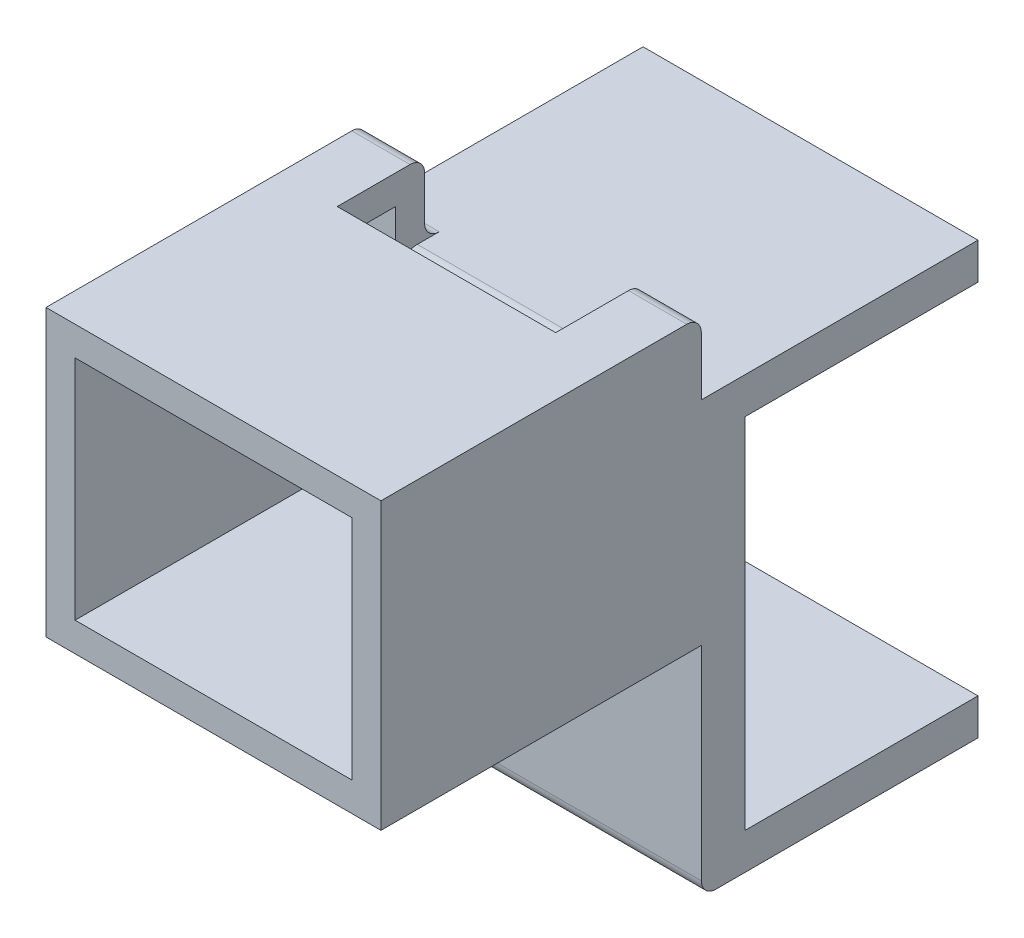
ISO-10303-21;
HEADER;
FILE_DESCRIPTION(('STEP AP214'),'2;1');
FILE_NAME('part.step','',(''),(''),'','','');
FILE_SCHEMA(('AUTOMOTIVE_DESIGN { 1 0 10303 214 1 1 1 1 }'));
ENDSEC;
DATA;
#1=APPLICATION_CONTEXT('core data for automotive mechanical design processes');
#2=APPLICATION_PROTOCOL_DEFINITION('international standard','automotive_design',2000,#1);
#3=PRODUCT_CONTEXT('',#1,'mechanical');
#4=PRODUCT('Part','Part','',(#3));
#5=PRODUCT_RELATED_PRODUCT_CATEGORY('part','',(#4));
#6=PRODUCT_DEFINITION_FORMATION('','',#4);
#7=PRODUCT_DEFINITION_CONTEXT('part definition',#1,'design');
#8=PRODUCT_DEFINITION('design','',#6,#7);
#9=PRODUCT_DEFINITION_SHAPE('','',#8);
#10=(LENGTH_UNIT() NAMED_UNIT(*) SI_UNIT(.MILLI.,.METRE.));
#11=(NAMED_UNIT(*) PLANE_ANGLE_UNIT() SI_UNIT($,.RADIAN.));
#12=(NAMED_UNIT(*) SI_UNIT($,.STERADIAN.) SOLID_ANGLE_UNIT());
#13=UNCERTAINTY_MEASURE_WITH_UNIT(LENGTH_MEASURE(1.E-05),#10,'distance_accuracy_value','');
#14=(GEOMETRIC_REPRESENTATION_CONTEXT(3) GLOBAL_UNCERTAINTY_ASSIGNED_CONTEXT((#13)) GLOBAL_UNIT_ASSIGNED_CONTEXT((#10,
#11,#12)) REPRESENTATION_CONTEXT('',''));
#15=CARTESIAN_POINT('',(0.,0.,0.));
#16=DIRECTION('',(0.,0.,1.));
#17=DIRECTION('',(1.,0.,0.));
#18=AXIS2_PLACEMENT_3D('',#15,#16,#17);
#19=CARTESIAN_POINT('',(0.,0.,-1.5));
#20=DIRECTION('',(0.,0.,1.));
#21=DIRECTION('',(1.,0.,0.));
#22=AXIS2_PLACEMENT_3D('',#19,#20,#21);
#23=PLANE('',#22);
#24=DIRECTION('',(1.,0.,0.));
#25=VECTOR('',#24,1.);
#26=CARTESIAN_POINT('',(11.5,-6.25,-1.5));
#27=LINE('',#26,#25);
#28=CARTESIAN_POINT('',(0.,-6.25,-1.5));
#29=VERTEX_POINT('',#28);
#30=CARTESIAN_POINT('',(11.5,-6.25,-1.5));
#31=VERTEX_POINT('',#30);
#32=EDGE_CURVE('E245',#29,#31,#27,.T.);
#33=ORIENTED_EDGE('',*,*,#32,.F.);
#34=DIRECTION('',(0.,1.,0.));
#35=VECTOR('',#34,1.);
#36=CARTESIAN_POINT('',(0.,-7.5,-1.5));
#37=LINE('',#36,#35);
#38=CARTESIAN_POINT('',(0.,6.05,-1.5));
#39=VERTEX_POINT('',#38);
#40=EDGE_CURVE('E280',#29,#39,#37,.T.);
#41=ORIENTED_EDGE('',*,*,#40,.T.);
#42=DIRECTION('',(-1.,0.,0.));
#43=VECTOR('',#42,1.);
#44=CARTESIAN_POINT('',(11.5,6.05,-1.5));
#45=LINE('',#44,#43);
#46=CARTESIAN_POINT('',(11.5,6.05,-1.5));
#47=VERTEX_POINT('',#46);
#48=EDGE_CURVE('E257',#47,#39,#45,.T.);
#49=ORIENTED_EDGE('',*,*,#48,.F.);
#50=DIRECTION('',(0.,-1.,0.));
#51=VECTOR('',#50,1.);
#52=CARTESIAN_POINT('',(11.5,-7.5,-1.5));
#53=LINE('',#52,#51);
#54=EDGE_CURVE('E278',#47,#31,#53,.T.);
#55=ORIENTED_EDGE('',*,*,#54,.T.);
#56=EDGE_LOOP('',(#33,#41,#49,#55));
#57=FACE_BOUND('',#56,.T.);
#58=ADVANCED_FACE('F33',(#57),#23,.F.);
#59=CARTESIAN_POINT('',(0.,0.,0.));
#60=DIRECTION('',(0.,0.,-1.));
#61=DIRECTION('',(-1.,0.,0.));
#62=AXIS2_PLACEMENT_3D('',#59,#60,#61);
#63=PLANE('',#62);
#64=DIRECTION('',(0.,-1.,0.));
#65=VECTOR('',#64,1.);
#66=CARTESIAN_POINT('',(0.,0.,0.));
#67=LINE('',#66,#65);
#68=CARTESIAN_POINT('',(0.,9.3,0.));
#69=VERTEX_POINT('',#68);
#70=CARTESIAN_POINT('',(0.,7.8,0.));
#71=VERTEX_POINT('',#70);
#72=EDGE_CURVE('E350',#69,#71,#67,.T.);
#73=ORIENTED_EDGE('',*,*,#72,.F.);
#74=DIRECTION('',(-1.,0.,0.));
#75=VECTOR('',#74,1.);
#76=CARTESIAN_POINT('',(2.,9.3,0.));
#77=LINE('',#76,#75);
#78=CARTESIAN_POINT('',(2.,9.3,0.));
#79=VERTEX_POINT('',#78);
#80=EDGE_CURVE('E425',#69,#79,#77,.F.);
#81=ORIENTED_EDGE('',*,*,#80,.T.);
#82=DIRECTION('',(0.,1.,0.));
#83=VECTOR('',#82,1.);
#84=CARTESIAN_POINT('',(2.,7.3,0.));
#85=LINE('',#84,#83);
#86=CARTESIAN_POINT('',(2.,7.8,0.));
#87=VERTEX_POINT('',#86);
#88=EDGE_CURVE('E309',#87,#79,#85,.T.);
#89=ORIENTED_EDGE('',*,*,#88,.F.);
#90=DIRECTION('',(1.,0.,0.));
#91=VECTOR('',#90,1.);
#92=CARTESIAN_POINT('',(0.,7.8,0.));
#93=LINE('',#92,#91);
#94=EDGE_CURVE('E423',#87,#71,#93,.F.);
#95=ORIENTED_EDGE('',*,*,#94,.T.);
#96=EDGE_LOOP('',(#73,#81,#89,#95));
#97=FACE_BOUND('',#96,.T.);
#98=ADVANCED_FACE('F444',(#97),#63,.T.);
#99=CARTESIAN_POINT('',(0.,0.,11.));
#100=DIRECTION('',(1.,0.,0.));
#101=DIRECTION('',(0.,0.,-1.));
#102=AXIS2_PLACEMENT_3D('',#99,#100,#101);
#103=PLANE('',#102);
#104=DIRECTION('',(0.,0.,-1.));
#105=VECTOR('',#104,1.);
#106=CARTESIAN_POINT('',(0.,9.8,11.));
#107=LINE('',#106,#105);
#108=CARTESIAN_POINT('',(0.,9.8,11.));
#109=VERTEX_POINT('',#108);
#110=CARTESIAN_POINT('',(0.,9.8,0.5));
#111=VERTEX_POINT('',#110);
#112=EDGE_CURVE('E367',#109,#111,#107,.T.);
#113=ORIENTED_EDGE('',*,*,#112,.T.);
#114=CARTESIAN_POINT('',(0.,9.3,0.5));
#115=DIRECTION('',(1.,0.,0.));
#116=DIRECTION('',(0.,0.,-1.));
#117=AXIS2_PLACEMENT_3D('',#114,#115,#116);
#118=CIRCLE('',#117,0.5);
#119=EDGE_CURVE('E421',#111,#69,#118,.F.);
#120=ORIENTED_EDGE('',*,*,#119,.T.);
#121=ORIENTED_EDGE('',*,*,#72,.T.);
#122=CARTESIAN_POINT('',(0.,7.8,-0.5));
#123=DIRECTION('',(1.,0.,0.));
#124=DIRECTION('',(0.,0.,-1.));
#125=AXIS2_PLACEMENT_3D('',#122,#123,#124);
#126=CIRCLE('',#125,0.5);
#127=CARTESIAN_POINT('',(0.,7.3,-0.5));
#128=VERTEX_POINT('',#127);
#129=EDGE_CURVE('E11',#71,#128,#126,.T.);
#130=ORIENTED_EDGE('',*,*,#129,.T.);
#131=DIRECTION('',(0.,0.,1.));
#132=VECTOR('',#131,1.);
#133=CARTESIAN_POINT('',(0.,7.3,-1.5));
#134=LINE('',#133,#132);
#135=CARTESIAN_POINT('',(0.,7.3,-9.5));
#136=VERTEX_POINT('',#135);
#137=EDGE_CURVE('E293',#136,#128,#134,.T.);
#138=ORIENTED_EDGE('',*,*,#137,.F.);
#139=DIRECTION('',(0.,1.,0.));
#140=VECTOR('',#139,1.);
#141=CARTESIAN_POINT('',(0.,6.05,-9.5));
#142=LINE('',#141,#140);
#143=CARTESIAN_POINT('',(0.,6.05,-9.5));
#144=VERTEX_POINT('',#143);
#145=EDGE_CURVE('E263',#144,#136,#142,.T.);
#146=ORIENTED_EDGE('',*,*,#145,.F.);
#147=DIRECTION('',(0.,0.,1.));
#148=VECTOR('',#147,1.);
#149=CARTESIAN_POINT('',(0.,6.05,-9.5));
#150=LINE('',#149,#148);
#151=EDGE_CURVE('E269',#144,#39,#150,.T.);
#152=ORIENTED_EDGE('',*,*,#151,.T.);
#153=ORIENTED_EDGE('',*,*,#40,.F.);
#154=DIRECTION('',(0.,0.,1.));
#155=VECTOR('',#154,1.);
#156=CARTESIAN_POINT('',(0.,-6.25,-9.5));
#157=LINE('',#156,#155);
#158=CARTESIAN_POINT('',(0.,-6.25,-9.5));
#159=VERTEX_POINT('',#158);
#160=EDGE_CURVE('E254',#159,#29,#157,.T.);
#161=ORIENTED_EDGE('',*,*,#160,.F.);
#162=DIRECTION('',(0.,1.,0.));
#163=VECTOR('',#162,1.);
#164=CARTESIAN_POINT('',(0.,-7.5,-9.5));
#165=LINE('',#164,#163);
#166=CARTESIAN_POINT('',(0.,-7.5,-9.5));
#167=VERTEX_POINT('',#166);
#168=EDGE_CURVE('E239',#167,#159,#165,.T.);
#169=ORIENTED_EDGE('',*,*,#168,.F.);
#170=DIRECTION('',(0.,0.,1.));
#171=VECTOR('',#170,1.);
#172=CARTESIAN_POINT('',(0.,-7.5,-1.5));
#173=LINE('',#172,#171);
#174=CARTESIAN_POINT('',(0.,-7.5,-0.5));
#175=VERTEX_POINT('',#174);
#176=EDGE_CURVE('E231',#167,#175,#173,.T.);
#177=ORIENTED_EDGE('',*,*,#176,.T.);
#178=CARTESIAN_POINT('',(0.,-7.,-0.5));
#179=DIRECTION('',(1.,0.,0.));
#180=DIRECTION('',(0.,0.,-1.));
#181=AXIS2_PLACEMENT_3D('',#178,#179,#180);
#182=CIRCLE('',#181,0.5);
#183=CARTESIAN_POINT('',(0.,-7.,0.));
#184=VERTEX_POINT('',#183);
#185=EDGE_CURVE('E410',#175,#184,#182,.F.);
#186=ORIENTED_EDGE('',*,*,#185,.T.);
#187=DIRECTION('',(0.,1.,0.));
#188=VECTOR('',#187,1.);
#189=CARTESIAN_POINT('',(0.,-7.5,0.));
#190=LINE('',#189,#188);
#191=CARTESIAN_POINT('',(0.,0.,0.));
#192=VERTEX_POINT('',#191);
#193=EDGE_CURVE('E281',#184,#192,#190,.T.);
#194=ORIENTED_EDGE('',*,*,#193,.T.);
#195=DIRECTION('',(0.,0.,-1.));
#196=VECTOR('',#195,1.);
#197=CARTESIAN_POINT('',(0.,0.,11.));
#198=LINE('',#197,#196);
#199=CARTESIAN_POINT('',(0.,0.,11.));
#200=VERTEX_POINT('',#199);
#201=EDGE_CURVE('E381',#200,#192,#198,.T.);
#202=ORIENTED_EDGE('',*,*,#201,.F.);
#203=DIRECTION('',(0.,-1.,0.));
#204=VECTOR('',#203,1.);
#205=CARTESIAN_POINT('',(0.,0.,11.));
#206=LINE('',#205,#204);
#207=EDGE_CURVE('E357',#109,#200,#206,.T.);
#208=ORIENTED_EDGE('',*,*,#207,.F.);
#209=EDGE_LOOP('',(#113,#120,#121,#130,#138,#146,#152,#153,#161,#169,#177,#186,#194,#202,#208));
#210=FACE_BOUND('',#209,.T.);
#211=ADVANCED_FACE('F448',(#210),#103,.F.);
#212=CARTESIAN_POINT('',(0.,0.,11.));
#213=DIRECTION('',(0.,1.,0.));
#214=DIRECTION('',(0.,0.,1.));
#215=AXIS2_PLACEMENT_3D('',#212,#213,#214);
#216=PLANE('',#215);
#217=DIRECTION('',(1.,0.,0.));
#218=VECTOR('',#217,1.);
#219=CARTESIAN_POINT('',(0.,0.,0.));
#220=LINE('',#219,#218);
#221=CARTESIAN_POINT('',(11.5,0.,0.));
#222=VERTEX_POINT('',#221);
#223=EDGE_CURVE('E370',#192,#222,#220,.T.);
#224=ORIENTED_EDGE('',*,*,#223,.T.);
#225=DIRECTION('',(0.,0.,-1.));
#226=VECTOR('',#225,1.);
#227=CARTESIAN_POINT('',(11.5,0.,11.));
#228=LINE('',#227,#226);
#229=CARTESIAN_POINT('',(11.5,0.,11.));
#230=VERTEX_POINT('',#229);
#231=EDGE_CURVE('E378',#230,#222,#228,.T.);
#232=ORIENTED_EDGE('',*,*,#231,.F.);
#233=DIRECTION('',(1.,0.,0.));
#234=VECTOR('',#233,1.);
#235=CARTESIAN_POINT('',(0.,0.,11.));
#236=LINE('',#235,#234);
#237=EDGE_CURVE('E360',#200,#230,#236,.T.);
#238=ORIENTED_EDGE('',*,*,#237,.F.);
#239=ORIENTED_EDGE('',*,*,#201,.T.);
#240=EDGE_LOOP('',(#224,#232,#238,#239));
#241=FACE_BOUND('',#240,.T.);
#242=ADVANCED_FACE('F527',(#241),#216,.F.);
#243=CARTESIAN_POINT('',(11.5,0.,11.));
#244=DIRECTION('',(-1.,0.,0.));
#245=DIRECTION('',(0.,0.,1.));
#246=AXIS2_PLACEMENT_3D('',#243,#244,#245);
#247=PLANE('',#246);
#248=DIRECTION('',(0.,1.,0.));
#249=VECTOR('',#248,1.);
#250=CARTESIAN_POINT('',(11.5,0.,0.));
#251=LINE('',#250,#249);
#252=CARTESIAN_POINT('',(11.5,7.3,0.));
#253=VERTEX_POINT('',#252);
#254=CARTESIAN_POINT('',(11.5,9.3,0.));
#255=VERTEX_POINT('',#254);
#256=EDGE_CURVE('E361',#253,#255,#251,.T.);
#257=ORIENTED_EDGE('',*,*,#256,.T.);
#258=CARTESIAN_POINT('',(11.5,9.3,0.5));
#259=DIRECTION('',(-1.,0.,0.));
#260=DIRECTION('',(0.,0.,1.));
#261=AXIS2_PLACEMENT_3D('',#258,#259,#260);
#262=CIRCLE('',#261,0.5);
#263=CARTESIAN_POINT('',(11.5,9.8,0.5));
#264=VERTEX_POINT('',#263);
#265=EDGE_CURVE('E432',#255,#264,#262,.F.);
#266=ORIENTED_EDGE('',*,*,#265,.T.);
#267=DIRECTION('',(0.,0.,-1.));
#268=VECTOR('',#267,1.);
#269=CARTESIAN_POINT('',(11.5,9.8,11.));
#270=LINE('',#269,#268);
#271=CARTESIAN_POINT('',(11.5,9.8,11.));
#272=VERTEX_POINT('',#271);
#273=EDGE_CURVE('E375',#272,#264,#270,.T.);
#274=ORIENTED_EDGE('',*,*,#273,.F.);
#275=DIRECTION('',(0.,1.,0.));
#276=VECTOR('',#275,1.);
#277=CARTESIAN_POINT('',(11.5,0.,11.));
#278=LINE('',#277,#276);
#279=EDGE_CURVE('E363',#230,#272,#278,.T.);
#280=ORIENTED_EDGE('',*,*,#279,.F.);
#281=ORIENTED_EDGE('',*,*,#231,.T.);
#282=DIRECTION('',(0.,-1.,0.));
#283=VECTOR('',#282,1.);
#284=CARTESIAN_POINT('',(11.5,-7.5,0.));
#285=LINE('',#284,#283);
#286=CARTESIAN_POINT('',(11.5,-7.,0.));
#287=VERTEX_POINT('',#286);
#288=EDGE_CURVE('E277',#222,#287,#285,.T.);
#289=ORIENTED_EDGE('',*,*,#288,.T.);
#290=CARTESIAN_POINT('',(11.5,-7.,-0.5));
#291=DIRECTION('',(-1.,0.,0.));
#292=DIRECTION('',(0.,0.,1.));
#293=AXIS2_PLACEMENT_3D('',#290,#291,#292);
#294=CIRCLE('',#293,0.5);
#295=CARTESIAN_POINT('',(11.5,-7.5,-0.5));
#296=VERTEX_POINT('',#295);
#297=EDGE_CURVE('E226',#287,#296,#294,.F.);
#298=ORIENTED_EDGE('',*,*,#297,.T.);
#299=DIRECTION('',(0.,0.,1.));
#300=VECTOR('',#299,1.);
#301=CARTESIAN_POINT('',(11.5,-7.5,-1.5));
#302=LINE('',#301,#300);
#303=CARTESIAN_POINT('',(11.5,-7.5,-9.5));
#304=VERTEX_POINT('',#303);
#305=EDGE_CURVE('E218',#304,#296,#302,.T.);
#306=ORIENTED_EDGE('',*,*,#305,.F.);
#307=DIRECTION('',(0.,-1.,0.));
#308=VECTOR('',#307,1.);
#309=CARTESIAN_POINT('',(11.5,-7.5,-9.5));
#310=LINE('',#309,#308);
#311=CARTESIAN_POINT('',(11.5,-6.25,-9.5));
#312=VERTEX_POINT('',#311);
#313=EDGE_CURVE('E223',#312,#304,#310,.T.);
#314=ORIENTED_EDGE('',*,*,#313,.F.);
#315=DIRECTION('',(0.,0.,1.));
#316=VECTOR('',#315,1.);
#317=CARTESIAN_POINT('',(11.5,-6.25,-9.5));
#318=LINE('',#317,#316);
#319=EDGE_CURVE('E251',#312,#31,#318,.T.);
#320=ORIENTED_EDGE('',*,*,#319,.T.);
#321=ORIENTED_EDGE('',*,*,#54,.F.);
#322=DIRECTION('',(0.,0.,1.));
#323=VECTOR('',#322,1.);
#324=CARTESIAN_POINT('',(11.5,6.05,-9.5));
#325=LINE('',#324,#323);
#326=CARTESIAN_POINT('',(11.5,6.05,-9.5));
#327=VERTEX_POINT('',#326);
#328=EDGE_CURVE('E274',#327,#47,#325,.T.);
#329=ORIENTED_EDGE('',*,*,#328,.F.);
#330=DIRECTION('',(0.,-1.,0.));
#331=VECTOR('',#330,1.);
#332=CARTESIAN_POINT('',(11.5,6.05,-9.5));
#333=LINE('',#332,#331);
#334=CARTESIAN_POINT('',(11.5,7.3,-9.5));
#335=VERTEX_POINT('',#334);
#336=EDGE_CURVE('E258',#335,#327,#333,.T.);
#337=ORIENTED_EDGE('',*,*,#336,.F.);
#338=DIRECTION('',(0.,0.,1.));
#339=VECTOR('',#338,1.);
#340=CARTESIAN_POINT('',(11.5,7.3,-1.5));
#341=LINE('',#340,#339);
#342=EDGE_CURVE('E283',#335,#253,#341,.T.);
#343=ORIENTED_EDGE('',*,*,#342,.T.);
#344=EDGE_LOOP('',(#257,#266,#274,#280,#281,#289,#298,#306,#314,#320,#321,#329,#337,#343));
#345=FACE_BOUND('',#344,.T.);
#346=ADVANCED_FACE('F220',(#345),#247,.F.);
#347=CARTESIAN_POINT('',(0.,9.8,11.));
#348=DIRECTION('',(0.,-1.,0.));
#349=DIRECTION('',(0.,0.,-1.));
#350=AXIS2_PLACEMENT_3D('',#347,#348,#349);
#351=PLANE('',#350);
#352=DIRECTION('',(0.,0.,1.));
#353=VECTOR('',#352,1.);
#354=CARTESIAN_POINT('',(2.,9.8,0.));
#355=LINE('',#354,#353);
#356=CARTESIAN_POINT('',(2.,9.8,0.5));
#357=VERTEX_POINT('',#356);
#358=CARTESIAN_POINT('',(2.,9.8,3.));
#359=VERTEX_POINT('',#358);
#360=EDGE_CURVE('E230',#357,#359,#355,.T.);
#361=ORIENTED_EDGE('',*,*,#360,.F.);
#362=DIRECTION('',(-1.,0.,0.));
#363=VECTOR('',#362,1.);
#364=CARTESIAN_POINT('',(0.,9.8,0.5));
#365=LINE('',#364,#363);
#366=EDGE_CURVE('E418',#357,#111,#365,.T.);
#367=ORIENTED_EDGE('',*,*,#366,.T.);
#368=ORIENTED_EDGE('',*,*,#112,.F.);
#369=DIRECTION('',(-1.,0.,0.));
#370=VECTOR('',#369,1.);
#371=CARTESIAN_POINT('',(0.,9.8,11.));
#372=LINE('',#371,#370);
#373=EDGE_CURVE('E365',#272,#109,#372,.T.);
#374=ORIENTED_EDGE('',*,*,#373,.F.);
#375=ORIENTED_EDGE('',*,*,#273,.T.);
#376=DIRECTION('',(-1.,0.,0.));
#377=VECTOR('',#376,1.);
#378=CARTESIAN_POINT('',(9.5,9.8,0.5));
#379=LINE('',#378,#377);
#380=CARTESIAN_POINT('',(9.5,9.8,0.5));
#381=VERTEX_POINT('',#380);
#382=EDGE_CURVE('E415',#264,#381,#379,.T.);
#383=ORIENTED_EDGE('',*,*,#382,.T.);
#384=DIRECTION('',(0.,0.,-1.));
#385=VECTOR('',#384,1.);
#386=CARTESIAN_POINT('',(9.5,9.8,0.));
#387=LINE('',#386,#385);
#388=CARTESIAN_POINT('',(9.5,9.8,3.));
#389=VERTEX_POINT('',#388);
#390=EDGE_CURVE('E299',#389,#381,#387,.T.);
#391=ORIENTED_EDGE('',*,*,#390,.F.);
#392=DIRECTION('',(1.,0.,0.));
#393=VECTOR('',#392,1.);
#394=CARTESIAN_POINT('',(2.,9.8,3.));
#395=LINE('',#394,#393);
#396=EDGE_CURVE('E304',#359,#389,#395,.T.);
#397=ORIENTED_EDGE('',*,*,#396,.F.);
#398=EDGE_LOOP('',(#361,#367,#368,#374,#375,#383,#391,#397));
#399=FACE_BOUND('',#398,.T.);
#400=ADVANCED_FACE('F518',(#399),#351,.F.);
#401=CARTESIAN_POINT('',(0.,0.,11.));
#402=DIRECTION('',(0.,0.,-1.));
#403=DIRECTION('',(-1.,0.,0.));
#404=AXIS2_PLACEMENT_3D('',#401,#402,#403);
#405=PLANE('',#404);
#406=DIRECTION('',(1.,0.,0.));
#407=VECTOR('',#406,1.);
#408=CARTESIAN_POINT('',(1.,1.,11.));
#409=LINE('',#408,#407);
#410=CARTESIAN_POINT('',(1.,1.,11.));
#411=VERTEX_POINT('',#410);
#412=CARTESIAN_POINT('',(10.5,1.,11.));
#413=VERTEX_POINT('',#412);
#414=EDGE_CURVE('E340',#411,#413,#409,.T.);
#415=ORIENTED_EDGE('',*,*,#414,.F.);
#416=DIRECTION('',(0.,-1.,0.));
#417=VECTOR('',#416,1.);
#418=CARTESIAN_POINT('',(1.,1.,11.));
#419=LINE('',#418,#417);
#420=CARTESIAN_POINT('',(1.,8.8,11.));
#421=VERTEX_POINT('',#420);
#422=EDGE_CURVE('E323',#421,#411,#419,.T.);
#423=ORIENTED_EDGE('',*,*,#422,.F.);
#424=DIRECTION('',(-1.,0.,0.));
#425=VECTOR('',#424,1.);
#426=CARTESIAN_POINT('',(1.,8.8,11.));
#427=LINE('',#426,#425);
#428=CARTESIAN_POINT('',(10.5,8.8,11.));
#429=VERTEX_POINT('',#428);
#430=EDGE_CURVE('E328',#429,#421,#427,.T.);
#431=ORIENTED_EDGE('',*,*,#430,.F.);
#432=DIRECTION('',(0.,1.,0.));
#433=VECTOR('',#432,1.);
#434=CARTESIAN_POINT('',(10.5,1.,11.));
#435=LINE('',#434,#433);
#436=EDGE_CURVE('E343',#413,#429,#435,.T.);
#437=ORIENTED_EDGE('',*,*,#436,.F.);
#438=EDGE_LOOP('',(#415,#423,#431,#437));
#439=FACE_BOUND('',#438,.T.);
#440=ORIENTED_EDGE('',*,*,#207,.T.);
#441=ORIENTED_EDGE('',*,*,#237,.T.);
#442=ORIENTED_EDGE('',*,*,#279,.T.);
#443=ORIENTED_EDGE('',*,*,#373,.T.);
#444=EDGE_LOOP('',(#440,#441,#442,#443));
#445=FACE_BOUND('',#444,.T.);
#446=ADVANCED_FACE('F516',(#439,#445),#405,.F.);
#447=DIRECTION('',(0.,1.,0.));
#448=VECTOR('',#447,1.);
#449=CARTESIAN_POINT('',(9.5,7.3,0.));
#450=LINE('',#449,#448);
#451=CARTESIAN_POINT('',(9.5,7.3,0.));
#452=VERTEX_POINT('',#451);
#453=CARTESIAN_POINT('',(9.5,9.3,0.));
#454=VERTEX_POINT('',#453);
#455=EDGE_CURVE('E313',#452,#454,#450,.T.);
#456=ORIENTED_EDGE('',*,*,#455,.T.);
#457=DIRECTION('',(-1.,0.,0.));
#458=VECTOR('',#457,1.);
#459=CARTESIAN_POINT('',(11.5,9.3,0.));
#460=LINE('',#459,#458);
#461=EDGE_CURVE('E56',#454,#255,#460,.F.);
#462=ORIENTED_EDGE('',*,*,#461,.T.);
#463=ORIENTED_EDGE('',*,*,#256,.F.);
#464=DIRECTION('',(1.,0.,0.));
#465=VECTOR('',#464,1.);
#466=CARTESIAN_POINT('',(11.5,7.3,0.));
#467=LINE('',#466,#465);
#468=EDGE_CURVE('E286',#452,#253,#467,.T.);
#469=ORIENTED_EDGE('',*,*,#468,.F.);
#470=EDGE_LOOP('',(#456,#462,#463,#469));
#471=FACE_BOUND('',#470,.T.);
#472=ADVANCED_FACE('F472',(#471),#63,.T.);
#473=CARTESIAN_POINT('',(1.,1.,0.999999999999999));
#474=DIRECTION('',(-1.,0.,0.));
#475=DIRECTION('',(0.,0.,1.));
#476=AXIS2_PLACEMENT_3D('',#473,#474,#475);
#477=PLANE('',#476);
#478=ORIENTED_EDGE('',*,*,#422,.T.);
#479=DIRECTION('',(0.,0.,1.));
#480=VECTOR('',#479,1.);
#481=CARTESIAN_POINT('',(1.,1.,0.999999999999999));
#482=LINE('',#481,#480);
#483=CARTESIAN_POINT('',(1.,1.,0.999999999999999));
#484=VERTEX_POINT('',#483);
#485=EDGE_CURVE('E338',#484,#411,#482,.T.);
#486=ORIENTED_EDGE('',*,*,#485,.F.);
#487=DIRECTION('',(0.,-1.,0.));
#488=VECTOR('',#487,1.);
#489=CARTESIAN_POINT('',(1.,1.,0.999999999999999));
#490=LINE('',#489,#488);
#491=CARTESIAN_POINT('',(1.,8.8,0.999999999999999));
#492=VERTEX_POINT('',#491);
#493=EDGE_CURVE('E324',#492,#484,#490,.T.);
#494=ORIENTED_EDGE('',*,*,#493,.F.);
#495=DIRECTION('',(0.,0.,1.));
#496=VECTOR('',#495,1.);
#497=CARTESIAN_POINT('',(1.,8.8,0.999999999999999));
#498=LINE('',#497,#496);
#499=EDGE_CURVE('E348',#492,#421,#498,.T.);
#500=ORIENTED_EDGE('',*,*,#499,.T.);
#501=EDGE_LOOP('',(#478,#486,#494,#500));
#502=FACE_BOUND('',#501,.T.);
#503=ADVANCED_FACE('F505',(#502),#477,.F.);
#504=CARTESIAN_POINT('',(1.,8.8,0.999999999999999));
#505=DIRECTION('',(0.,1.,0.));
#506=DIRECTION('',(0.,0.,1.));
#507=AXIS2_PLACEMENT_3D('',#504,#505,#506);
#508=PLANE('',#507);
#509=DIRECTION('',(1.,0.,0.));
#510=VECTOR('',#509,1.);
#511=CARTESIAN_POINT('',(1.,8.8,3.75));
#512=LINE('',#511,#510);
#513=CARTESIAN_POINT('',(2.,8.8,3.75));
#514=VERTEX_POINT('',#513);
#515=CARTESIAN_POINT('',(9.5,8.8,3.75));
#516=VERTEX_POINT('',#515);
#517=EDGE_CURVE('E389',#514,#516,#512,.T.);
#518=ORIENTED_EDGE('',*,*,#517,.T.);
#519=DIRECTION('',(0.,0.,-1.));
#520=VECTOR('',#519,1.);
#521=CARTESIAN_POINT('',(9.5,8.8,0.999999999999999));
#522=LINE('',#521,#520);
#523=CARTESIAN_POINT('',(9.5,8.8,0.999999999999999));
#524=VERTEX_POINT('',#523);
#525=EDGE_CURVE('E312',#516,#524,#522,.T.);
#526=ORIENTED_EDGE('',*,*,#525,.T.);
#527=DIRECTION('',(-1.,0.,0.));
#528=VECTOR('',#527,1.);
#529=CARTESIAN_POINT('',(1.,8.8,0.999999999999999));
#530=LINE('',#529,#528);
#531=CARTESIAN_POINT('',(10.5,8.8,0.999999999999999));
#532=VERTEX_POINT('',#531);
#533=EDGE_CURVE('E335',#532,#524,#530,.T.);
#534=ORIENTED_EDGE('',*,*,#533,.F.);
#535=DIRECTION('',(0.,0.,1.));
#536=VECTOR('',#535,1.);
#537=CARTESIAN_POINT('',(10.5,8.8,0.999999999999999));
#538=LINE('',#537,#536);
#539=EDGE_CURVE('E351',#532,#429,#538,.T.);
#540=ORIENTED_EDGE('',*,*,#539,.T.);
#541=ORIENTED_EDGE('',*,*,#430,.T.);
#542=ORIENTED_EDGE('',*,*,#499,.F.);
#543=CARTESIAN_POINT('',(2.,8.8,0.999999999999999));
#544=VERTEX_POINT('',#543);
#545=EDGE_CURVE('E334',#544,#492,#530,.T.);
#546=ORIENTED_EDGE('',*,*,#545,.F.);
#547=DIRECTION('',(0.,0.,1.));
#548=VECTOR('',#547,1.);
#549=CARTESIAN_POINT('',(2.,8.8,0.999999999999999));
#550=LINE('',#549,#548);
#551=EDGE_CURVE('E321',#544,#514,#550,.T.);
#552=ORIENTED_EDGE('',*,*,#551,.T.);
#553=EDGE_LOOP('',(#518,#526,#534,#540,#541,#542,#546,#552));
#554=FACE_BOUND('',#553,.T.);
#555=ADVANCED_FACE('F501',(#554),#508,.F.);
#556=CARTESIAN_POINT('',(10.5,1.,0.999999999999999));
#557=DIRECTION('',(1.,0.,0.));
#558=DIRECTION('',(0.,0.,-1.));
#559=AXIS2_PLACEMENT_3D('',#556,#557,#558);
#560=PLANE('',#559);
#561=ORIENTED_EDGE('',*,*,#436,.T.);
#562=ORIENTED_EDGE('',*,*,#539,.F.);
#563=DIRECTION('',(0.,1.,0.));
#564=VECTOR('',#563,1.);
#565=CARTESIAN_POINT('',(10.5,1.,0.999999999999999));
#566=LINE('',#565,#564);
#567=CARTESIAN_POINT('',(10.5,1.,0.999999999999999));
#568=VERTEX_POINT('',#567);
#569=EDGE_CURVE('E331',#568,#532,#566,.T.);
#570=ORIENTED_EDGE('',*,*,#569,.F.);
#571=DIRECTION('',(0.,0.,1.));
#572=VECTOR('',#571,1.);
#573=CARTESIAN_POINT('',(10.5,1.,0.999999999999999));
#574=LINE('',#573,#572);
#575=EDGE_CURVE('E353',#568,#413,#574,.T.);
#576=ORIENTED_EDGE('',*,*,#575,.T.);
#577=EDGE_LOOP('',(#561,#562,#570,#576));
#578=FACE_BOUND('',#577,.T.);
#579=ADVANCED_FACE('F504',(#578),#560,.F.);
#580=CARTESIAN_POINT('',(1.,1.,0.999999999999999));
#581=DIRECTION('',(0.,-1.,0.));
#582=DIRECTION('',(0.,0.,-1.));
#583=AXIS2_PLACEMENT_3D('',#580,#581,#582);
#584=PLANE('',#583);
#585=ORIENTED_EDGE('',*,*,#414,.T.);
#586=ORIENTED_EDGE('',*,*,#575,.F.);
#587=DIRECTION('',(1.,0.,0.));
#588=VECTOR('',#587,1.);
#589=CARTESIAN_POINT('',(1.,1.,0.999999999999999));
#590=LINE('',#589,#588);
#591=EDGE_CURVE('E327',#484,#568,#590,.T.);
#592=ORIENTED_EDGE('',*,*,#591,.F.);
#593=ORIENTED_EDGE('',*,*,#485,.T.);
#594=EDGE_LOOP('',(#585,#586,#592,#593));
#595=FACE_BOUND('',#594,.T.);
#596=ADVANCED_FACE('F499',(#595),#584,.F.);
#597=CARTESIAN_POINT('',(0.,0.,0.999999999999999));
#598=DIRECTION('',(0.,0.,-1.));
#599=DIRECTION('',(-1.,0.,0.));
#600=AXIS2_PLACEMENT_3D('',#597,#598,#599);
#601=PLANE('',#600);
#602=DIRECTION('',(0.,-1.,0.));
#603=VECTOR('',#602,1.);
#604=CARTESIAN_POINT('',(9.5,0.,0.999999999999999));
#605=LINE('',#604,#603);
#606=CARTESIAN_POINT('',(9.5,6.55,0.999999999999999));
#607=VERTEX_POINT('',#606);
#608=EDGE_CURVE('E384',#524,#607,#605,.T.);
#609=ORIENTED_EDGE('',*,*,#608,.T.);
#610=DIRECTION('',(1.,0.,0.));
#611=VECTOR('',#610,1.);
#612=CARTESIAN_POINT('',(2.,6.55,0.999999999999999));
#613=LINE('',#612,#611);
#614=CARTESIAN_POINT('',(2.,6.55,0.999999999999999));
#615=VERTEX_POINT('',#614);
#616=EDGE_CURVE('E397',#607,#615,#613,.F.);
#617=ORIENTED_EDGE('',*,*,#616,.T.);
#618=DIRECTION('',(0.,1.,0.));
#619=VECTOR('',#618,1.);
#620=CARTESIAN_POINT('',(2.,0.,0.999999999999999));
#621=LINE('',#620,#619);
#622=EDGE_CURVE('E386',#615,#544,#621,.T.);
#623=ORIENTED_EDGE('',*,*,#622,.T.);
#624=ORIENTED_EDGE('',*,*,#545,.T.);
#625=ORIENTED_EDGE('',*,*,#493,.T.);
#626=ORIENTED_EDGE('',*,*,#591,.T.);
#627=ORIENTED_EDGE('',*,*,#569,.T.);
#628=ORIENTED_EDGE('',*,*,#533,.T.);
#629=EDGE_LOOP('',(#609,#617,#623,#624,#625,#626,#627,#628));
#630=FACE_BOUND('',#629,.T.);
#631=ADVANCED_FACE('F493',(#630),#601,.F.);
#632=CARTESIAN_POINT('',(2.,7.3,3.));
#633=DIRECTION('',(0.,0.,1.));
#634=DIRECTION('',(1.,0.,0.));
#635=AXIS2_PLACEMENT_3D('',#632,#633,#634);
#636=PLANE('',#635);
#637=DIRECTION('',(0.,1.,0.));
#638=VECTOR('',#637,1.);
#639=CARTESIAN_POINT('',(9.5,7.3,3.));
#640=LINE('',#639,#638);
#641=CARTESIAN_POINT('',(9.5,9.55,3.));
#642=VERTEX_POINT('',#641);
#643=EDGE_CURVE('E315',#642,#389,#640,.T.);
#644=ORIENTED_EDGE('',*,*,#643,.F.);
#645=DIRECTION('',(1.,0.,0.));
#646=VECTOR('',#645,1.);
#647=CARTESIAN_POINT('',(2.,9.55,3.));
#648=LINE('',#647,#646);
#649=CARTESIAN_POINT('',(2.,9.55,3.));
#650=VERTEX_POINT('',#649);
#651=EDGE_CURVE('E392',#642,#650,#648,.F.);
#652=ORIENTED_EDGE('',*,*,#651,.T.);
#653=DIRECTION('',(0.,1.,0.));
#654=VECTOR('',#653,1.);
#655=CARTESIAN_POINT('',(2.,7.3,3.));
#656=LINE('',#655,#654);
#657=EDGE_CURVE('E302',#650,#359,#656,.T.);
#658=ORIENTED_EDGE('',*,*,#657,.T.);
#659=ORIENTED_EDGE('',*,*,#396,.T.);
#660=EDGE_LOOP('',(#644,#652,#658,#659));
#661=FACE_BOUND('',#660,.T.);
#662=ADVANCED_FACE('F490',(#661),#636,.F.);
#663=CARTESIAN_POINT('',(2.,7.3,0.));
#664=DIRECTION('',(-1.,0.,0.));
#665=DIRECTION('',(0.,0.,1.));
#666=AXIS2_PLACEMENT_3D('',#663,#664,#665);
#667=PLANE('',#666);
#668=ORIENTED_EDGE('',*,*,#88,.T.);
#669=CARTESIAN_POINT('',(2.,9.3,0.5));
#670=DIRECTION('',(-1.,0.,0.));
#671=DIRECTION('',(0.,0.,1.));
#672=AXIS2_PLACEMENT_3D('',#669,#670,#671);
#673=CIRCLE('',#672,0.5);
#674=EDGE_CURVE('E427',#79,#357,#673,.F.);
#675=ORIENTED_EDGE('',*,*,#674,.T.);
#676=ORIENTED_EDGE('',*,*,#360,.T.);
#677=ORIENTED_EDGE('',*,*,#657,.F.);
#678=CARTESIAN_POINT('',(2.,9.55,3.75));
#679=DIRECTION('',(-1.,0.,0.));
#680=DIRECTION('',(0.,0.,1.));
#681=AXIS2_PLACEMENT_3D('',#678,#679,#680);
#682=CIRCLE('',#681,0.75);
#683=EDGE_CURVE('E402',#650,#514,#682,.T.);
#684=ORIENTED_EDGE('',*,*,#683,.T.);
#685=ORIENTED_EDGE('',*,*,#551,.F.);
#686=ORIENTED_EDGE('',*,*,#622,.F.);
#687=CARTESIAN_POINT('',(2.,6.55,0.249999999999999));
#688=DIRECTION('',(-1.,0.,0.));
#689=DIRECTION('',(0.,0.,1.));
#690=AXIS2_PLACEMENT_3D('',#687,#688,#689);
#691=CIRCLE('',#690,0.75);
#692=CARTESIAN_POINT('',(2.,7.3,0.249999999999999));
#693=VERTEX_POINT('',#692);
#694=EDGE_CURVE('E290',#615,#693,#691,.T.);
#695=ORIENTED_EDGE('',*,*,#694,.T.);
#696=DIRECTION('',(0.,0.,1.));
#697=VECTOR('',#696,1.);
#698=CARTESIAN_POINT('',(2.,7.3,0.));
#699=LINE('',#698,#697);
#700=CARTESIAN_POINT('',(2.,7.3,-0.5));
#701=VERTEX_POINT('',#700);
#702=EDGE_CURVE('E48',#701,#693,#699,.T.);
#703=ORIENTED_EDGE('',*,*,#702,.F.);
#704=CARTESIAN_POINT('',(2.,7.8,-0.5));
#705=DIRECTION('',(-1.,0.,0.));
#706=DIRECTION('',(0.,0.,1.));
#707=AXIS2_PLACEMENT_3D('',#704,#705,#706);
#708=CIRCLE('',#707,0.5);
#709=EDGE_CURVE('E41',#701,#87,#708,.T.);
#710=ORIENTED_EDGE('',*,*,#709,.T.);
#711=EDGE_LOOP('',(#668,#675,#676,#677,#684,#685,#686,#695,#703,#710));
#712=FACE_BOUND('',#711,.T.);
#713=ADVANCED_FACE('F437',(#712),#667,.F.);
#714=CARTESIAN_POINT('',(9.5,7.3,0.));
#715=DIRECTION('',(1.,0.,0.));
#716=DIRECTION('',(0.,0.,-1.));
#717=AXIS2_PLACEMENT_3D('',#714,#715,#716);
#718=PLANE('',#717);
#719=ORIENTED_EDGE('',*,*,#390,.T.);
#720=CARTESIAN_POINT('',(9.5,9.3,0.5));
#721=DIRECTION('',(1.,0.,0.));
#722=DIRECTION('',(0.,0.,-1.));
#723=AXIS2_PLACEMENT_3D('',#720,#721,#722);
#724=CIRCLE('',#723,0.5);
#725=EDGE_CURVE('E429',#381,#454,#724,.F.);
#726=ORIENTED_EDGE('',*,*,#725,.T.);
#727=ORIENTED_EDGE('',*,*,#455,.F.);
#728=DIRECTION('',(0.,0.,-1.));
#729=VECTOR('',#728,1.);
#730=CARTESIAN_POINT('',(9.5,7.3,0.));
#731=LINE('',#730,#729);
#732=CARTESIAN_POINT('',(9.5,7.3,0.249999999999999));
#733=VERTEX_POINT('',#732);
#734=EDGE_CURVE('E298',#733,#452,#731,.T.);
#735=ORIENTED_EDGE('',*,*,#734,.F.);
#736=CARTESIAN_POINT('',(9.5,6.55,0.249999999999999));
#737=DIRECTION('',(1.,0.,0.));
#738=DIRECTION('',(0.,0.,-1.));
#739=AXIS2_PLACEMENT_3D('',#736,#737,#738);
#740=CIRCLE('',#739,0.75);
#741=EDGE_CURVE('E405',#733,#607,#740,.T.);
#742=ORIENTED_EDGE('',*,*,#741,.T.);
#743=ORIENTED_EDGE('',*,*,#608,.F.);
#744=ORIENTED_EDGE('',*,*,#525,.F.);
#745=CARTESIAN_POINT('',(9.5,9.55,3.75));
#746=DIRECTION('',(1.,0.,0.));
#747=DIRECTION('',(0.,0.,-1.));
#748=AXIS2_PLACEMENT_3D('',#745,#746,#747);
#749=CIRCLE('',#748,0.75);
#750=EDGE_CURVE('E400',#516,#642,#749,.T.);
#751=ORIENTED_EDGE('',*,*,#750,.T.);
#752=ORIENTED_EDGE('',*,*,#643,.T.);
#753=EDGE_LOOP('',(#719,#726,#727,#735,#742,#743,#744,#751,#752));
#754=FACE_BOUND('',#753,.T.);
#755=ADVANCED_FACE('F486',(#754),#718,.F.);
#756=CARTESIAN_POINT('',(0.,7.3,0.));
#757=DIRECTION('',(0.,1.,0.));
#758=DIRECTION('',(0.,0.,1.));
#759=AXIS2_PLACEMENT_3D('',#756,#757,#758);
#760=PLANE('',#759);
#761=ORIENTED_EDGE('',*,*,#137,.T.);
#762=DIRECTION('',(1.,0.,0.));
#763=VECTOR('',#762,1.);
#764=CARTESIAN_POINT('',(2.,7.3,-0.5));
#765=LINE('',#764,#763);
#766=EDGE_CURVE('E434',#128,#701,#765,.T.);
#767=ORIENTED_EDGE('',*,*,#766,.T.);
#768=ORIENTED_EDGE('',*,*,#702,.T.);
#769=DIRECTION('',(1.,0.,0.));
#770=VECTOR('',#769,1.);
#771=CARTESIAN_POINT('',(9.5,7.3,0.249999999999999));
#772=LINE('',#771,#770);
#773=EDGE_CURVE('E394',#693,#733,#772,.T.);
#774=ORIENTED_EDGE('',*,*,#773,.T.);
#775=ORIENTED_EDGE('',*,*,#734,.T.);
#776=ORIENTED_EDGE('',*,*,#468,.T.);
#777=ORIENTED_EDGE('',*,*,#342,.F.);
#778=DIRECTION('',(1.,0.,0.));
#779=VECTOR('',#778,1.);
#780=CARTESIAN_POINT('',(11.5,7.3,-9.5));
#781=LINE('',#780,#779);
#782=EDGE_CURVE('E266',#136,#335,#781,.T.);
#783=ORIENTED_EDGE('',*,*,#782,.F.);
#784=EDGE_LOOP('',(#761,#767,#768,#774,#775,#776,#777,#783));
#785=FACE_BOUND('',#784,.T.);
#786=ADVANCED_FACE('F452',(#785),#760,.T.);
#787=CARTESIAN_POINT('',(1.,9.55,3.75));
#788=DIRECTION('',(1.,0.,0.));
#789=DIRECTION('',(0.,0.,-1.));
#790=AXIS2_PLACEMENT_3D('',#787,#788,#789);
#791=CYLINDRICAL_SURFACE('',#790,0.75);
#792=ORIENTED_EDGE('',*,*,#683,.F.);
#793=ORIENTED_EDGE('',*,*,#651,.F.);
#794=ORIENTED_EDGE('',*,*,#750,.F.);
#795=ORIENTED_EDGE('',*,*,#517,.F.);
#796=EDGE_LOOP('',(#792,#793,#794,#795));
#797=FACE_BOUND('',#796,.T.);
#798=ADVANCED_FACE('F485',(#797),#791,.T.);
#799=CARTESIAN_POINT('',(0.,6.55,0.249999999999999));
#800=DIRECTION('',(-1.,0.,0.));
#801=DIRECTION('',(0.,0.,1.));
#802=AXIS2_PLACEMENT_3D('',#799,#800,#801);
#803=CYLINDRICAL_SURFACE('',#802,0.75);
#804=ORIENTED_EDGE('',*,*,#694,.F.);
#805=ORIENTED_EDGE('',*,*,#616,.F.);
#806=ORIENTED_EDGE('',*,*,#741,.F.);
#807=ORIENTED_EDGE('',*,*,#773,.F.);
#808=EDGE_LOOP('',(#804,#805,#806,#807));
#809=FACE_BOUND('',#808,.T.);
#810=ADVANCED_FACE('F479',(#809),#803,.T.);
#811=CARTESIAN_POINT('',(0.,0.,0.));
#812=DIRECTION('',(0.,0.,1.));
#813=DIRECTION('',(1.,0.,0.));
#814=AXIS2_PLACEMENT_3D('',#811,#812,#813);
#815=PLANE('',#814);
#816=ORIENTED_EDGE('',*,*,#193,.F.);
#817=DIRECTION('',(-1.,0.,0.));
#818=VECTOR('',#817,1.);
#819=CARTESIAN_POINT('',(11.5,-7.,0.));
#820=LINE('',#819,#818);
#821=EDGE_CURVE('E412',#184,#287,#820,.F.);
#822=ORIENTED_EDGE('',*,*,#821,.T.);
#823=ORIENTED_EDGE('',*,*,#288,.F.);
#824=ORIENTED_EDGE('',*,*,#223,.F.);
#825=EDGE_LOOP('',(#816,#822,#823,#824));
#826=FACE_BOUND('',#825,.T.);
#827=ADVANCED_FACE('F476',(#826),#815,.T.);
#828=CARTESIAN_POINT('',(11.5,-7.5,-1.5));
#829=DIRECTION('',(0.,1.,0.));
#830=DIRECTION('',(0.,0.,1.));
#831=AXIS2_PLACEMENT_3D('',#828,#829,#830);
#832=PLANE('',#831);
#833=ORIENTED_EDGE('',*,*,#305,.T.);
#834=DIRECTION('',(-1.,0.,0.));
#835=VECTOR('',#834,1.);
#836=CARTESIAN_POINT('',(0.,-7.5,-0.5));
#837=LINE('',#836,#835);
#838=EDGE_CURVE('E289',#296,#175,#837,.T.);
#839=ORIENTED_EDGE('',*,*,#838,.T.);
#840=ORIENTED_EDGE('',*,*,#176,.F.);
#841=DIRECTION('',(-1.,0.,0.));
#842=VECTOR('',#841,1.);
#843=CARTESIAN_POINT('',(11.5,-7.5,-9.5));
#844=LINE('',#843,#842);
#845=EDGE_CURVE('E234',#304,#167,#844,.T.);
#846=ORIENTED_EDGE('',*,*,#845,.F.);
#847=EDGE_LOOP('',(#833,#839,#840,#846));
#848=FACE_BOUND('',#847,.T.);
#849=ADVANCED_FACE('F235',(#848),#832,.F.);
#850=CARTESIAN_POINT('',(11.5,6.05,-9.5));
#851=DIRECTION('',(0.,1.,0.));
#852=DIRECTION('',(0.,0.,1.));
#853=AXIS2_PLACEMENT_3D('',#850,#851,#852);
#854=PLANE('',#853);
#855=ORIENTED_EDGE('',*,*,#48,.T.);
#856=ORIENTED_EDGE('',*,*,#151,.F.);
#857=DIRECTION('',(-1.,0.,0.));
#858=VECTOR('',#857,1.);
#859=CARTESIAN_POINT('',(11.5,6.05,-9.5));
#860=LINE('',#859,#858);
#861=EDGE_CURVE('E261',#327,#144,#860,.T.);
#862=ORIENTED_EDGE('',*,*,#861,.F.);
#863=ORIENTED_EDGE('',*,*,#328,.T.);
#864=EDGE_LOOP('',(#855,#856,#862,#863));
#865=FACE_BOUND('',#864,.T.);
#866=ADVANCED_FACE('F459',(#865),#854,.F.);
#867=CARTESIAN_POINT('',(0.,0.,-9.5));
#868=DIRECTION('',(0.,0.,1.));
#869=DIRECTION('',(1.,0.,0.));
#870=AXIS2_PLACEMENT_3D('',#867,#868,#869);
#871=PLANE('',#870);
#872=ORIENTED_EDGE('',*,*,#336,.T.);
#873=ORIENTED_EDGE('',*,*,#861,.T.);
#874=ORIENTED_EDGE('',*,*,#145,.T.);
#875=ORIENTED_EDGE('',*,*,#782,.T.);
#876=EDGE_LOOP('',(#872,#873,#874,#875));
#877=FACE_BOUND('',#876,.T.);
#878=ADVANCED_FACE('F455',(#877),#871,.F.);
#879=CARTESIAN_POINT('',(11.5,-6.25,-9.5));
#880=DIRECTION('',(0.,-1.,0.));
#881=DIRECTION('',(0.,0.,-1.));
#882=AXIS2_PLACEMENT_3D('',#879,#880,#881);
#883=PLANE('',#882);
#884=ORIENTED_EDGE('',*,*,#32,.T.);
#885=ORIENTED_EDGE('',*,*,#319,.F.);
#886=DIRECTION('',(1.,0.,0.));
#887=VECTOR('',#886,1.);
#888=CARTESIAN_POINT('',(11.5,-6.25,-9.5));
#889=LINE('',#888,#887);
#890=EDGE_CURVE('E243',#159,#312,#889,.T.);
#891=ORIENTED_EDGE('',*,*,#890,.F.);
#892=ORIENTED_EDGE('',*,*,#160,.T.);
#893=EDGE_LOOP('',(#884,#885,#891,#892));
#894=FACE_BOUND('',#893,.T.);
#895=ADVANCED_FACE('F465',(#894),#883,.F.);
#896=CARTESIAN_POINT('',(0.,0.,-9.5));
#897=DIRECTION('',(0.,0.,1.));
#898=DIRECTION('',(1.,0.,0.));
#899=AXIS2_PLACEMENT_3D('',#896,#897,#898);
#900=PLANE('',#899);
#901=ORIENTED_EDGE('',*,*,#313,.T.);
#902=ORIENTED_EDGE('',*,*,#845,.T.);
#903=ORIENTED_EDGE('',*,*,#168,.T.);
#904=ORIENTED_EDGE('',*,*,#890,.T.);
#905=EDGE_LOOP('',(#901,#902,#903,#904));
#906=FACE_BOUND('',#905,.T.);
#907=ADVANCED_FACE('F241',(#906),#900,.F.);
#908=CARTESIAN_POINT('',(11.5,-7.,-0.5));
#909=DIRECTION('',(1.,0.,0.));
#910=DIRECTION('',(0.,0.,-1.));
#911=AXIS2_PLACEMENT_3D('',#908,#909,#910);
#912=CYLINDRICAL_SURFACE('',#911,0.5);
#913=ORIENTED_EDGE('',*,*,#297,.F.);
#914=ORIENTED_EDGE('',*,*,#821,.F.);
#915=ORIENTED_EDGE('',*,*,#185,.F.);
#916=ORIENTED_EDGE('',*,*,#838,.F.);
#917=EDGE_LOOP('',(#913,#914,#915,#916));
#918=FACE_BOUND('',#917,.T.);
#919=ADVANCED_FACE('F539',(#918),#912,.T.);
#920=CARTESIAN_POINT('',(0.,9.3,0.5));
#921=DIRECTION('',(1.,0.,0.));
#922=DIRECTION('',(0.,0.,-1.));
#923=AXIS2_PLACEMENT_3D('',#920,#921,#922);
#924=CYLINDRICAL_SURFACE('',#923,0.5);
#925=ORIENTED_EDGE('',*,*,#674,.F.);
#926=ORIENTED_EDGE('',*,*,#80,.F.);
#927=ORIENTED_EDGE('',*,*,#119,.F.);
#928=ORIENTED_EDGE('',*,*,#366,.F.);
#929=EDGE_LOOP('',(#925,#926,#927,#928));
#930=FACE_BOUND('',#929,.T.);
#931=ADVANCED_FACE('F542',(#930),#924,.T.);
#932=CARTESIAN_POINT('',(0.,9.3,0.5));
#933=DIRECTION('',(1.,0.,0.));
#934=DIRECTION('',(0.,0.,-1.));
#935=AXIS2_PLACEMENT_3D('',#932,#933,#934);
#936=CYLINDRICAL_SURFACE('',#935,0.5);
#937=ORIENTED_EDGE('',*,*,#265,.F.);
#938=ORIENTED_EDGE('',*,*,#461,.F.);
#939=ORIENTED_EDGE('',*,*,#725,.F.);
#940=ORIENTED_EDGE('',*,*,#382,.F.);
#941=EDGE_LOOP('',(#937,#938,#939,#940));
#942=FACE_BOUND('',#941,.T.);
#943=ADVANCED_FACE('F545',(#942),#936,.T.);
#944=CARTESIAN_POINT('',(0.,7.8,-0.5));
#945=DIRECTION('',(-1.,0.,0.));
#946=DIRECTION('',(0.,0.,1.));
#947=AXIS2_PLACEMENT_3D('',#944,#945,#946);
#948=CYLINDRICAL_SURFACE('',#947,0.5);
#949=ORIENTED_EDGE('',*,*,#129,.F.);
#950=ORIENTED_EDGE('',*,*,#94,.F.);
#951=ORIENTED_EDGE('',*,*,#709,.F.);
#952=ORIENTED_EDGE('',*,*,#766,.F.);
#953=EDGE_LOOP('',(#949,#950,#951,#952));
#954=FACE_BOUND('',#953,.T.);
#955=ADVANCED_FACE('F35',(#954),#948,.F.);
#956=CLOSED_SHELL('',(#58,#98,#211,#242,#346,#400,#446,#472,#503,#555,#579,#596,#631,#662,#713,
#755,#786,#798,#810,#827,#849,#866,#878,#895,#907,#919,#931,#943,#955));
#957=MANIFOLD_SOLID_BREP('B2',#956);
#958=ADVANCED_BREP_SHAPE_REPRESENTATION('',(#18,#957),#14);
#959=SHAPE_DEFINITION_REPRESENTATION(#9,#958);
ENDSEC;
END-ISO-10303-21;
